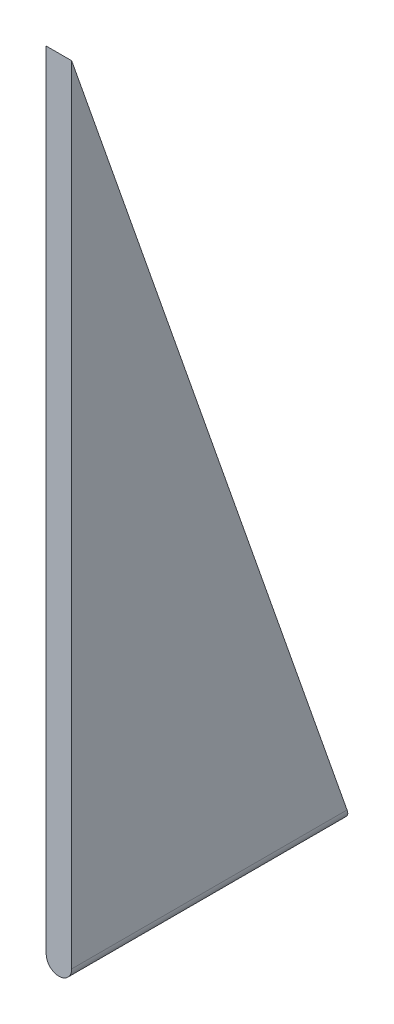
ISO-10303-21;
HEADER;
FILE_DESCRIPTION(('STEP AP214'),'2;1');
FILE_NAME('part.step','',(''),(''),'','','');
FILE_SCHEMA(('AUTOMOTIVE_DESIGN { 1 0 10303 214 1 1 1 1 }'));
ENDSEC;
DATA;
#1=APPLICATION_CONTEXT('core data for automotive mechanical design processes');
#2=APPLICATION_PROTOCOL_DEFINITION('international standard','automotive_design',2000,#1);
#3=PRODUCT_CONTEXT('',#1,'mechanical');
#4=PRODUCT('Part','Part','',(#3));
#5=PRODUCT_RELATED_PRODUCT_CATEGORY('part','',(#4));
#6=PRODUCT_DEFINITION_FORMATION('','',#4);
#7=PRODUCT_DEFINITION_CONTEXT('part definition',#1,'design');
#8=PRODUCT_DEFINITION('design','',#6,#7);
#9=PRODUCT_DEFINITION_SHAPE('','',#8);
#10=(LENGTH_UNIT() NAMED_UNIT(*) SI_UNIT(.MILLI.,.METRE.));
#11=(NAMED_UNIT(*) PLANE_ANGLE_UNIT() SI_UNIT($,.RADIAN.));
#12=(NAMED_UNIT(*) SI_UNIT($,.STERADIAN.) SOLID_ANGLE_UNIT());
#13=UNCERTAINTY_MEASURE_WITH_UNIT(LENGTH_MEASURE(1.E-05),#10,'distance_accuracy_value','');
#14=(GEOMETRIC_REPRESENTATION_CONTEXT(3) GLOBAL_UNCERTAINTY_ASSIGNED_CONTEXT((#13)) GLOBAL_UNIT_ASSIGNED_CONTEXT((#10,
#11,#12)) REPRESENTATION_CONTEXT('',''));
#15=CARTESIAN_POINT('',(0.,0.,0.));
#16=DIRECTION('',(0.,0.,1.));
#17=DIRECTION('',(1.,0.,0.));
#18=AXIS2_PLACEMENT_3D('',#15,#16,#17);
#19=CARTESIAN_POINT('',(1.5875,-39.7109750462107,-34.3692234245703));
#20=DIRECTION('',(0.,0.,-1.));
#21=DIRECTION('',(-1.,0.,0.));
#22=AXIS2_PLACEMENT_3D('',#19,#20,#21);
#23=CYLINDRICAL_SURFACE('',#22,1.5875);
#24=DIRECTION('',(0.,0.,-1.));
#25=VECTOR('',#24,1.);
#26=CARTESIAN_POINT('',(0.,-39.7109750462107,0.));
#27=LINE('',#26,#25);
#28=CARTESIAN_POINT('',(0.,-39.7109750462107,-34.3692234245703));
#29=VERTEX_POINT('',#28);
#30=CARTESIAN_POINT('',(0.,-39.7109750462107,0.));
#31=VERTEX_POINT('',#30);
#32=EDGE_CURVE('E82',#29,#31,#27,.F.);
#33=ORIENTED_EDGE('',*,*,#32,.F.);
#34=CARTESIAN_POINT('',(1.5875,-39.7109750462107,-34.3692234245703));
#35=DIRECTION('',(0.,-0.33043070635301,0.94383025396469));
#36=DIRECTION('',(0.,-0.94383025396469,-0.33043070635301));
#37=AXIS2_PLACEMENT_3D('',#34,#35,#36);
#38=ELLIPSE('',#37,1.68197617456263,1.5875);
#39=CARTESIAN_POINT('',(3.175,-39.7109750462107,-34.3692234245703));
#40=VERTEX_POINT('',#39);
#41=EDGE_CURVE('E43',#40,#29,#38,.F.);
#42=ORIENTED_EDGE('',*,*,#41,.F.);
#43=DIRECTION('',(0.,0.,1.));
#44=VECTOR('',#43,1.);
#45=CARTESIAN_POINT('',(3.175,-39.7109750462107,-34.3692234245703));
#46=LINE('',#45,#44);
#47=CARTESIAN_POINT('',(3.175,-39.7109750462107,0.));
#48=VERTEX_POINT('',#47);
#49=EDGE_CURVE('E72',#48,#40,#46,.F.);
#50=ORIENTED_EDGE('',*,*,#49,.F.);
#51=CARTESIAN_POINT('',(1.5875,-39.7109750462107,0.));
#52=DIRECTION('',(0.,0.,-1.));
#53=DIRECTION('',(-1.,0.,0.));
#54=AXIS2_PLACEMENT_3D('',#51,#52,#53);
#55=CIRCLE('',#54,1.5875);
#56=EDGE_CURVE('E11',#31,#48,#55,.F.);
#57=ORIENTED_EDGE('',*,*,#56,.F.);
#58=EDGE_LOOP('',(#33,#42,#50,#57));
#59=FACE_BOUND('',#58,.T.);
#60=ADVANCED_FACE('F35',(#59),#23,.T.);
#61=CARTESIAN_POINT('',(3.175,58.4600249537893,0.));
#62=DIRECTION('',(0.,-0.33043070635301,0.94383025396469));
#63=DIRECTION('',(0.,-0.94383025396469,-0.33043070635301));
#64=AXIS2_PLACEMENT_3D('',#61,#62,#63);
#65=PLANE('',#64);
#66=DIRECTION('',(0.,0.94383025396469,0.33043070635301));
#67=VECTOR('',#66,1.);
#68=CARTESIAN_POINT('',(3.175,58.4600249537893,0.));
#69=LINE('',#68,#67);
#70=CARTESIAN_POINT('',(3.175,58.4600249537893,0.));
#71=VERTEX_POINT('',#70);
#72=EDGE_CURVE('E68',#40,#71,#69,.T.);
#73=ORIENTED_EDGE('',*,*,#72,.F.);
#74=ORIENTED_EDGE('',*,*,#41,.T.);
#75=DIRECTION('',(0.,0.94383025396469,0.33043070635301));
#76=VECTOR('',#75,1.);
#77=CARTESIAN_POINT('',(0.,58.4600249537893,0.));
#78=LINE('',#77,#76);
#79=CARTESIAN_POINT('',(0.,58.4600249537893,0.));
#80=VERTEX_POINT('',#79);
#81=EDGE_CURVE('E80',#29,#80,#78,.T.);
#82=ORIENTED_EDGE('',*,*,#81,.T.);
#83=DIRECTION('',(-1.,0.,0.));
#84=VECTOR('',#83,1.);
#85=CARTESIAN_POINT('',(3.175,58.4600249537893,0.));
#86=LINE('',#85,#84);
#87=EDGE_CURVE('E77',#71,#80,#86,.T.);
#88=ORIENTED_EDGE('',*,*,#87,.F.);
#89=EDGE_LOOP('',(#73,#74,#82,#88));
#90=FACE_BOUND('',#89,.T.);
#91=ADVANCED_FACE('F78',(#90),#65,.F.);
#92=CARTESIAN_POINT('',(3.175,-41.2984750462107,0.));
#93=DIRECTION('',(0.,0.,-1.));
#94=DIRECTION('',(-1.,0.,0.));
#95=AXIS2_PLACEMENT_3D('',#92,#93,#94);
#96=PLANE('',#95);
#97=DIRECTION('',(0.,-1.,0.));
#98=VECTOR('',#97,1.);
#99=CARTESIAN_POINT('',(0.,-41.2984750462107,0.));
#100=LINE('',#99,#98);
#101=EDGE_CURVE('E74',#80,#31,#100,.T.);
#102=ORIENTED_EDGE('',*,*,#101,.T.);
#103=ORIENTED_EDGE('',*,*,#56,.T.);
#104=DIRECTION('',(0.,-1.,0.));
#105=VECTOR('',#104,1.);
#106=CARTESIAN_POINT('',(3.175,-41.2984750462107,0.));
#107=LINE('',#106,#105);
#108=EDGE_CURVE('E71',#71,#48,#107,.T.);
#109=ORIENTED_EDGE('',*,*,#108,.F.);
#110=ORIENTED_EDGE('',*,*,#87,.T.);
#111=EDGE_LOOP('',(#102,#103,#109,#110));
#112=FACE_BOUND('',#111,.T.);
#113=ADVANCED_FACE('F84',(#112),#96,.F.);
#114=CARTESIAN_POINT('',(3.175,0.,0.));
#115=DIRECTION('',(1.,0.,0.));
#116=DIRECTION('',(0.,0.,-1.));
#117=AXIS2_PLACEMENT_3D('',#114,#115,#116);
#118=PLANE('',#117);
#119=ORIENTED_EDGE('',*,*,#108,.T.);
#120=ORIENTED_EDGE('',*,*,#49,.T.);
#121=ORIENTED_EDGE('',*,*,#72,.T.);
#122=EDGE_LOOP('',(#119,#120,#121));
#123=FACE_BOUND('',#122,.T.);
#124=ADVANCED_FACE('F70',(#123),#118,.T.);
#125=CARTESIAN_POINT('',(0.,0.,0.));
#126=DIRECTION('',(1.,0.,0.));
#127=DIRECTION('',(0.,0.,-1.));
#128=AXIS2_PLACEMENT_3D('',#125,#126,#127);
#129=PLANE('',#128);
#130=ORIENTED_EDGE('',*,*,#81,.F.);
#131=ORIENTED_EDGE('',*,*,#32,.T.);
#132=ORIENTED_EDGE('',*,*,#101,.F.);
#133=EDGE_LOOP('',(#130,#131,#132));
#134=FACE_BOUND('',#133,.T.);
#135=ADVANCED_FACE('F92',(#134),#129,.F.);
#136=CLOSED_SHELL('',(#60,#91,#113,#124,#135));
#137=MANIFOLD_SOLID_BREP('B2',#136);
#138=ADVANCED_BREP_SHAPE_REPRESENTATION('',(#18,#137),#14);
#139=SHAPE_DEFINITION_REPRESENTATION(#9,#138);
ENDSEC;
END-ISO-10303-21;
